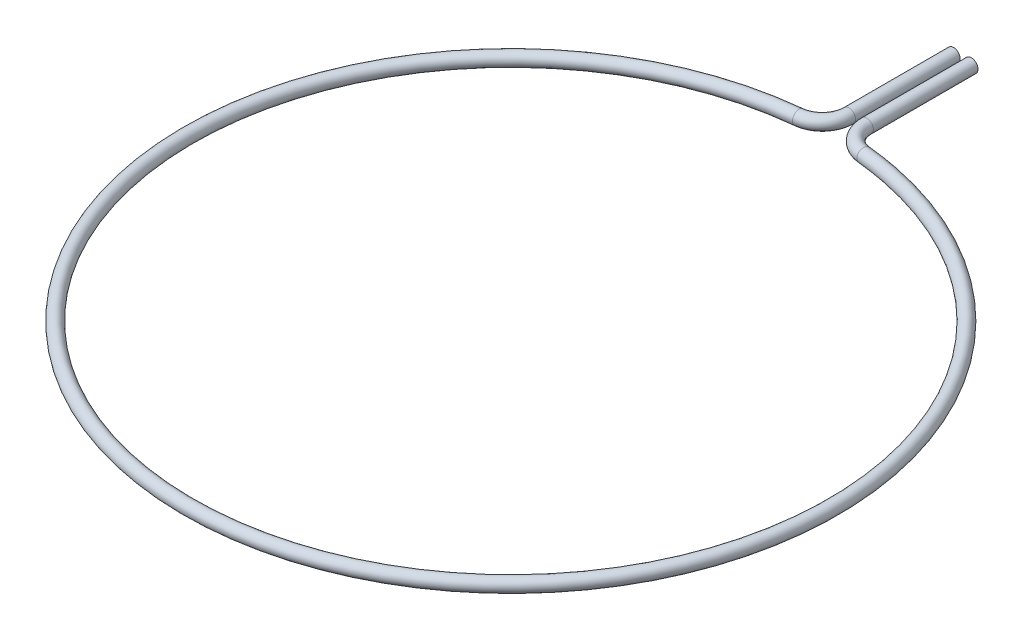
ISO-10303-21;
HEADER;
FILE_DESCRIPTION(('STEP AP214'),'2;1');
FILE_NAME('part.step','',(''),(''),'','','');
FILE_SCHEMA(('AUTOMOTIVE_DESIGN { 1 0 10303 214 1 1 1 1 }'));
ENDSEC;
DATA;
#1=APPLICATION_CONTEXT('core data for automotive mechanical design processes');
#2=APPLICATION_PROTOCOL_DEFINITION('international standard','automotive_design',2000,#1);
#3=PRODUCT_CONTEXT('',#1,'mechanical');
#4=PRODUCT('Part','Part','',(#3));
#5=PRODUCT_RELATED_PRODUCT_CATEGORY('part','',(#4));
#6=PRODUCT_DEFINITION_FORMATION('','',#4);
#7=PRODUCT_DEFINITION_CONTEXT('part definition',#1,'design');
#8=PRODUCT_DEFINITION('design','',#6,#7);
#9=PRODUCT_DEFINITION_SHAPE('','',#8);
#10=(LENGTH_UNIT() NAMED_UNIT(*) SI_UNIT(.MILLI.,.METRE.));
#11=(NAMED_UNIT(*) PLANE_ANGLE_UNIT() SI_UNIT($,.RADIAN.));
#12=(NAMED_UNIT(*) SI_UNIT($,.STERADIAN.) SOLID_ANGLE_UNIT());
#13=UNCERTAINTY_MEASURE_WITH_UNIT(LENGTH_MEASURE(1.E-05),#10,'distance_accuracy_value','');
#14=(GEOMETRIC_REPRESENTATION_CONTEXT(3) GLOBAL_UNCERTAINTY_ASSIGNED_CONTEXT((#13)) GLOBAL_UNIT_ASSIGNED_CONTEXT((#10,
#11,#12)) REPRESENTATION_CONTEXT('',''));
#15=CARTESIAN_POINT('',(0.,0.,0.));
#16=DIRECTION('',(0.,0.,1.));
#17=DIRECTION('',(1.,0.,0.));
#18=AXIS2_PLACEMENT_3D('',#15,#16,#17);
#19=CARTESIAN_POINT('',(-4.00000000000001,0.,-203.397366868336));
#20=DIRECTION('',(0.,0.,-1.));
#21=DIRECTION('',(-1.,0.,0.));
#22=AXIS2_PLACEMENT_3D('',#19,#20,#21);
#23=PLANE('',#22);
#24=CARTESIAN_POINT('',(-4.00000000000001,0.,-203.397366868336));
#25=DIRECTION('',(0.,0.,-1.));
#26=DIRECTION('',(-1.,0.,0.));
#27=AXIS2_PLACEMENT_3D('',#24,#25,#26);
#28=CIRCLE('',#27,3.);
#29=CARTESIAN_POINT('',(-7.00000000000001,0.,-203.397366868336));
#30=VERTEX_POINT('',#29);
#31=EDGE_CURVE('E54',#30,#30,#28,.T.);
#32=ORIENTED_EDGE('',*,*,#31,.T.);
#33=EDGE_LOOP('',(#32));
#34=FACE_BOUND('',#33,.T.);
#35=ADVANCED_FACE('F32',(#34),#23,.T.);
#36=CARTESIAN_POINT('',(3.99999999999999,0.,-203.397366868336));
#37=DIRECTION('',(0.,0.,1.));
#38=DIRECTION('',(1.,0.,0.));
#39=AXIS2_PLACEMENT_3D('',#36,#37,#38);
#40=PLANE('',#39);
#41=CARTESIAN_POINT('',(3.99999999999999,0.,-203.397366868336));
#42=DIRECTION('',(0.,0.,1.));
#43=DIRECTION('',(1.,0.,0.));
#44=AXIS2_PLACEMENT_3D('',#41,#42,#43);
#45=CIRCLE('',#44,3.);
#46=CARTESIAN_POINT('',(6.99999999999999,0.,-203.397366868336));
#47=VERTEX_POINT('',#46);
#48=EDGE_CURVE('E10',#47,#47,#45,.T.);
#49=ORIENTED_EDGE('',*,*,#48,.F.);
#50=EDGE_LOOP('',(#49));
#51=FACE_BOUND('',#50,.T.);
#52=ADVANCED_FACE('F62',(#51),#40,.F.);
#53=CARTESIAN_POINT('',(-4.00000000000001,0.,-203.397366868336));
#54=DIRECTION('',(0.,0.,1.));
#55=DIRECTION('',(1.,0.,0.));
#56=AXIS2_PLACEMENT_3D('',#53,#54,#55);
#57=CYLINDRICAL_SURFACE('',#56,3.);
#58=CARTESIAN_POINT('',(-4.,0.,-156.283108492249));
#59=DIRECTION('',(0.,0.,-1.));
#60=DIRECTION('',(-1.,0.,0.));
#61=AXIS2_PLACEMENT_3D('',#58,#59,#60);
#62=CIRCLE('',#61,3.);
#63=CARTESIAN_POINT('',(-1.,0.,-156.283108492249));
#64=VERTEX_POINT('',#63);
#65=EDGE_CURVE('E51',#64,#64,#62,.T.);
#66=ORIENTED_EDGE('',*,*,#65,.T.);
#67=EDGE_LOOP('',(#66));
#68=FACE_BOUND('',#67,.T.);
#69=ORIENTED_EDGE('',*,*,#31,.F.);
#70=EDGE_LOOP('',(#69));
#71=FACE_BOUND('',#70,.T.);
#72=ADVANCED_FACE('F59',(#68,#71),#57,.T.);
#73=CARTESIAN_POINT('',(-16.,0.,-156.283108492249));
#74=DIRECTION('',(0.,-1.,0.));
#75=DIRECTION('',(0.,0.,-1.));
#76=AXIS2_PLACEMENT_3D('',#73,#74,#75);
#77=TOROIDAL_SURFACE('',#76,12.,3.);
#78=CARTESIAN_POINT('',(-14.7778485041375,0.,-144.345506315884));
#79=DIRECTION('',(0.994800181363774,0.,-0.101845957988538));
#80=DIRECTION('',(-0.101845957988538,0.,-0.994800181363774));
#81=AXIS2_PLACEMENT_3D('',#78,#79,#80);
#82=CIRCLE('',#81,3.);
#83=CARTESIAN_POINT('',(-14.4723106301719,0.,-141.361105771792));
#84=VERTEX_POINT('',#83);
#85=EDGE_CURVE('E46',#84,#84,#82,.T.);
#86=CARTESIAN_POINT('',(-16.,0.,-156.283108492249));
#87=DIRECTION('',(0.,-1.,0.));
#88=DIRECTION('',(0.,0.,-1.));
#89=AXIS2_PLACEMENT_3D('',#86,#87,#88);
#90=CIRCLE('',#89,15.);
#91=EDGE_CURVE('',#64,#84,#90,.T.);
#92=ORIENTED_EDGE('',*,*,#65,.F.);
#93=ORIENTED_EDGE('',*,*,#85,.T.);
#94=ORIENTED_EDGE('',*,*,#91,.T.);
#95=ORIENTED_EDGE('',*,*,#91,.F.);
#96=EDGE_LOOP('',(#92,#94,#93,#95));
#97=FACE_BOUND('',#96,.T.);
#98=ADVANCED_FACE('F61',(#97),#77,.T.);
#99=CARTESIAN_POINT('',(0.,0.,0.));
#100=DIRECTION('',(0.,1.,0.));
#101=DIRECTION('',(0.,0.,1.));
#102=AXIS2_PLACEMENT_3D('',#99,#100,#101);
#103=TOROIDAL_SURFACE('',#102,145.1,3.);
#104=CARTESIAN_POINT('',(14.7778485041375,0.,-144.345506315884));
#105=DIRECTION('',(0.994800181363773,0.,0.101845957988543));
#106=DIRECTION('',(0.101845957988543,0.,-0.994800181363773));
#107=AXIS2_PLACEMENT_3D('',#104,#105,#106);
#108=CIRCLE('',#107,3.);
#109=CARTESIAN_POINT('',(14.4723106301719,0.,-141.361105771792));
#110=VERTEX_POINT('',#109);
#111=EDGE_CURVE('E42',#110,#110,#108,.T.);
#112=ORIENTED_EDGE('',*,*,#111,.T.);
#113=EDGE_LOOP('',(#112));
#114=FACE_BOUND('',#113,.T.);
#115=ORIENTED_EDGE('',*,*,#85,.F.);
#116=EDGE_LOOP('',(#115));
#117=FACE_BOUND('',#116,.T.);
#118=ADVANCED_FACE('F69',(#114,#117),#103,.T.);
#119=CARTESIAN_POINT('',(16.,0.,-156.283108492249));
#120=DIRECTION('',(0.,-1.,0.));
#121=DIRECTION('',(0.,0.,-1.));
#122=AXIS2_PLACEMENT_3D('',#119,#120,#121);
#123=TOROIDAL_SURFACE('',#122,12.,3.);
#124=CARTESIAN_POINT('',(3.99999999999997,0.,-156.283108492249));
#125=DIRECTION('',(0.,0.,1.));
#126=DIRECTION('',(1.,0.,0.));
#127=AXIS2_PLACEMENT_3D('',#124,#125,#126);
#128=CIRCLE('',#127,3.);
#129=CARTESIAN_POINT('',(1.,0.,-156.283108492249));
#130=VERTEX_POINT('',#129);
#131=EDGE_CURVE('E38',#130,#130,#128,.T.);
#132=CARTESIAN_POINT('',(16.,0.,-156.283108492249));
#133=DIRECTION('',(0.,-1.,0.));
#134=DIRECTION('',(0.,0.,-1.));
#135=AXIS2_PLACEMENT_3D('',#132,#133,#134);
#136=CIRCLE('',#135,15.);
#137=EDGE_CURVE('',#110,#130,#136,.T.);
#138=ORIENTED_EDGE('',*,*,#111,.F.);
#139=ORIENTED_EDGE('',*,*,#131,.T.);
#140=ORIENTED_EDGE('',*,*,#137,.T.);
#141=ORIENTED_EDGE('',*,*,#137,.F.);
#142=EDGE_LOOP('',(#138,#140,#139,#141));
#143=FACE_BOUND('',#142,.T.);
#144=ADVANCED_FACE('F75',(#143),#123,.T.);
#145=CARTESIAN_POINT('',(4.,0.,-156.283108492249));
#146=DIRECTION('',(0.,0.,-1.));
#147=DIRECTION('',(-1.,0.,0.));
#148=AXIS2_PLACEMENT_3D('',#145,#146,#147);
#149=CYLINDRICAL_SURFACE('',#148,3.);
#150=ORIENTED_EDGE('',*,*,#48,.T.);
#151=EDGE_LOOP('',(#150));
#152=FACE_BOUND('',#151,.T.);
#153=ORIENTED_EDGE('',*,*,#131,.F.);
#154=EDGE_LOOP('',(#153));
#155=FACE_BOUND('',#154,.T.);
#156=ADVANCED_FACE('F73',(#152,#155),#149,.T.);
#157=CLOSED_SHELL('',(#35,#52,#72,#98,#118,#144,#156));
#158=MANIFOLD_SOLID_BREP('B2',#157);
#159=ADVANCED_BREP_SHAPE_REPRESENTATION('',(#18,#158),#14);
#160=SHAPE_DEFINITION_REPRESENTATION(#9,#159);
ENDSEC;
END-ISO-10303-21;
